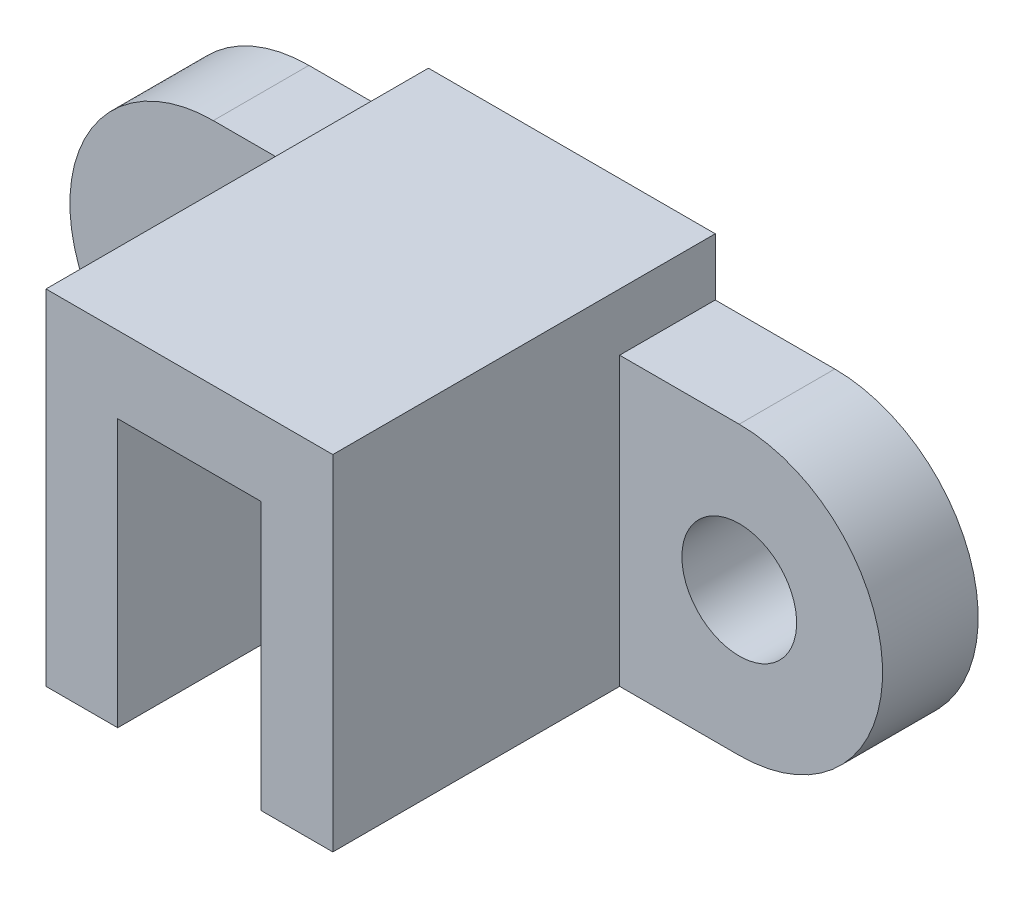
ISO-10303-21;
HEADER;
FILE_DESCRIPTION(('STEP AP214'),'2;1');
FILE_NAME('part.step','',(''),(''),'','','');
FILE_SCHEMA(('AUTOMOTIVE_DESIGN { 1 0 10303 214 1 1 1 1 }'));
ENDSEC;
DATA;
#1=APPLICATION_CONTEXT('core data for automotive mechanical design processes');
#2=APPLICATION_PROTOCOL_DEFINITION('international standard','automotive_design',2000,#1);
#3=PRODUCT_CONTEXT('',#1,'mechanical');
#4=PRODUCT('Part','Part','',(#3));
#5=PRODUCT_RELATED_PRODUCT_CATEGORY('part','',(#4));
#6=PRODUCT_DEFINITION_FORMATION('','',#4);
#7=PRODUCT_DEFINITION_CONTEXT('part definition',#1,'design');
#8=PRODUCT_DEFINITION('design','',#6,#7);
#9=PRODUCT_DEFINITION_SHAPE('','',#8);
#10=(LENGTH_UNIT() NAMED_UNIT(*) SI_UNIT(.MILLI.,.METRE.));
#11=(NAMED_UNIT(*) PLANE_ANGLE_UNIT() SI_UNIT($,.RADIAN.));
#12=(NAMED_UNIT(*) SI_UNIT($,.STERADIAN.) SOLID_ANGLE_UNIT());
#13=UNCERTAINTY_MEASURE_WITH_UNIT(LENGTH_MEASURE(1.E-05),#10,'distance_accuracy_value','');
#14=(GEOMETRIC_REPRESENTATION_CONTEXT(3) GLOBAL_UNCERTAINTY_ASSIGNED_CONTEXT((#13)) GLOBAL_UNIT_ASSIGNED_CONTEXT((#10,
#11,#12)) REPRESENTATION_CONTEXT('',''));
#15=CARTESIAN_POINT('',(0.,0.,0.));
#16=DIRECTION('',(0.,0.,1.));
#17=DIRECTION('',(1.,0.,0.));
#18=AXIS2_PLACEMENT_3D('',#15,#16,#17);
#19=CARTESIAN_POINT('',(-27.4999999999999,-18.,10.));
#20=DIRECTION('',(0.,1.,0.));
#21=DIRECTION('',(-1.,0.,0.));
#22=AXIS2_PLACEMENT_3D('',#19,#20,#21);
#23=PLANE('',#22);
#24=DIRECTION('',(0.,0.,1.));
#25=VECTOR('',#24,1.);
#26=CARTESIAN_POINT('',(-7.49999999999999,-18.,0.));
#27=LINE('',#26,#25);
#28=CARTESIAN_POINT('',(-7.49999999999999,-18.,0.));
#29=VERTEX_POINT('',#28);
#30=CARTESIAN_POINT('',(-7.49999999999999,-18.,40.));
#31=VERTEX_POINT('',#30);
#32=EDGE_CURVE('E161',#29,#31,#27,.T.);
#33=ORIENTED_EDGE('',*,*,#32,.T.);
#34=DIRECTION('',(1.,0.,0.));
#35=VECTOR('',#34,1.);
#36=CARTESIAN_POINT('',(15.,-18.,40.));
#37=LINE('',#36,#35);
#38=CARTESIAN_POINT('',(-15.,-18.,40.));
#39=VERTEX_POINT('',#38);
#40=EDGE_CURVE('E188',#39,#31,#37,.T.);
#41=ORIENTED_EDGE('',*,*,#40,.F.);
#42=DIRECTION('',(0.,0.,-1.));
#43=VECTOR('',#42,1.);
#44=CARTESIAN_POINT('',(-15.,-18.,40.));
#45=LINE('',#44,#43);
#46=CARTESIAN_POINT('',(-15.,-18.,10.));
#47=VERTEX_POINT('',#46);
#48=EDGE_CURVE('E201',#39,#47,#45,.T.);
#49=ORIENTED_EDGE('',*,*,#48,.T.);
#50=DIRECTION('',(-1.,0.,0.));
#51=VECTOR('',#50,1.);
#52=CARTESIAN_POINT('',(27.4999999999999,-18.,10.));
#53=LINE('',#52,#51);
#54=CARTESIAN_POINT('',(-27.4999999999999,-18.,10.));
#55=VERTEX_POINT('',#54);
#56=EDGE_CURVE('E66',#47,#55,#53,.T.);
#57=ORIENTED_EDGE('',*,*,#56,.T.);
#58=DIRECTION('',(0.,0.,-1.));
#59=VECTOR('',#58,1.);
#60=CARTESIAN_POINT('',(-27.4999999999999,-18.,10.));
#61=LINE('',#60,#59);
#62=CARTESIAN_POINT('',(-27.4999999999999,-18.,0.));
#63=VERTEX_POINT('',#62);
#64=EDGE_CURVE('E243',#55,#63,#61,.T.);
#65=ORIENTED_EDGE('',*,*,#64,.T.);
#66=DIRECTION('',(1.,0.,0.));
#67=VECTOR('',#66,1.);
#68=CARTESIAN_POINT('',(-27.4999999999999,-18.,0.));
#69=LINE('',#68,#67);
#70=EDGE_CURVE('E233',#63,#29,#69,.T.);
#71=ORIENTED_EDGE('',*,*,#70,.T.);
#72=EDGE_LOOP('',(#33,#41,#49,#57,#65,#71));
#73=FACE_BOUND('',#72,.T.);
#74=ADVANCED_FACE('F41',(#73),#23,.F.);
#75=CARTESIAN_POINT('',(27.5,-3.,10.));
#76=DIRECTION('',(0.,0.,-1.));
#77=DIRECTION('',(-1.,0.,0.));
#78=AXIS2_PLACEMENT_3D('',#75,#76,#77);
#79=PLANE('',#78);
#80=CARTESIAN_POINT('',(-27.5,-3.,10.));
#81=DIRECTION('',(0.,0.,-1.));
#82=DIRECTION('',(-1.,0.,0.));
#83=AXIS2_PLACEMENT_3D('',#80,#81,#82);
#84=CIRCLE('',#83,6.);
#85=CARTESIAN_POINT('',(-33.5,-3.,10.));
#86=VERTEX_POINT('',#85);
#87=EDGE_CURVE('E180',#86,#86,#84,.F.);
#88=ORIENTED_EDGE('',*,*,#87,.F.);
#89=EDGE_LOOP('',(#88));
#90=FACE_BOUND('',#89,.T.);
#91=DIRECTION('',(0.,-1.,0.));
#92=VECTOR('',#91,1.);
#93=CARTESIAN_POINT('',(-15.,-18.,10.));
#94=LINE('',#93,#92);
#95=CARTESIAN_POINT('',(-15.,12.,10.));
#96=VERTEX_POINT('',#95);
#97=EDGE_CURVE('E11',#96,#47,#94,.T.);
#98=ORIENTED_EDGE('',*,*,#97,.F.);
#99=DIRECTION('',(-1.,0.,0.));
#100=VECTOR('',#99,1.);
#101=CARTESIAN_POINT('',(-15.,12.,10.));
#102=LINE('',#101,#100);
#103=CARTESIAN_POINT('',(-27.4999999999999,12.,10.));
#104=VERTEX_POINT('',#103);
#105=EDGE_CURVE('E216',#96,#104,#102,.T.);
#106=ORIENTED_EDGE('',*,*,#105,.T.);
#107=CARTESIAN_POINT('',(-27.5,-3.,10.));
#108=DIRECTION('',(0.,0.,1.));
#109=DIRECTION('',(1.,0.,0.));
#110=AXIS2_PLACEMENT_3D('',#107,#108,#109);
#111=CIRCLE('',#110,15.);
#112=EDGE_CURVE('E214',#104,#55,#111,.T.);
#113=ORIENTED_EDGE('',*,*,#112,.T.);
#114=ORIENTED_EDGE('',*,*,#56,.F.);
#115=EDGE_LOOP('',(#98,#106,#113,#114));
#116=FACE_BOUND('',#115,.T.);
#117=ADVANCED_FACE('F278',(#90,#116),#79,.F.);
#118=CARTESIAN_POINT('',(27.511001477956,-3.,10.));
#119=DIRECTION('',(0.,0.,-1.));
#120=DIRECTION('',(-1.,0.,0.));
#121=AXIS2_PLACEMENT_3D('',#118,#119,#120);
#122=CIRCLE('',#121,6.);
#123=CARTESIAN_POINT('',(21.511001477956,-3.,10.));
#124=VERTEX_POINT('',#123);
#125=EDGE_CURVE('E175',#124,#124,#122,.F.);
#126=ORIENTED_EDGE('',*,*,#125,.F.);
#127=EDGE_LOOP('',(#126));
#128=FACE_BOUND('',#127,.T.);
#129=DIRECTION('',(0.,1.,0.));
#130=VECTOR('',#129,1.);
#131=CARTESIAN_POINT('',(15.,18.,10.));
#132=LINE('',#131,#130);
#133=CARTESIAN_POINT('',(15.,-18.,10.));
#134=VERTEX_POINT('',#133);
#135=CARTESIAN_POINT('',(15.,12.,10.));
#136=VERTEX_POINT('',#135);
#137=EDGE_CURVE('E183',#134,#136,#132,.T.);
#138=ORIENTED_EDGE('',*,*,#137,.F.);
#139=CARTESIAN_POINT('',(27.4999999999999,-18.,10.));
#140=VERTEX_POINT('',#139);
#141=EDGE_CURVE('E211',#140,#134,#53,.T.);
#142=ORIENTED_EDGE('',*,*,#141,.F.);
#143=CARTESIAN_POINT('',(27.5,-3.,10.));
#144=DIRECTION('',(0.,0.,-1.));
#145=DIRECTION('',(-1.,0.,0.));
#146=AXIS2_PLACEMENT_3D('',#143,#144,#145);
#147=CIRCLE('',#146,15.);
#148=CARTESIAN_POINT('',(27.4999999999999,12.,10.));
#149=VERTEX_POINT('',#148);
#150=EDGE_CURVE('E208',#149,#140,#147,.T.);
#151=ORIENTED_EDGE('',*,*,#150,.F.);
#152=DIRECTION('',(1.,0.,0.));
#153=VECTOR('',#152,1.);
#154=CARTESIAN_POINT('',(15.,12.,10.));
#155=LINE('',#154,#153);
#156=EDGE_CURVE('E205',#136,#149,#155,.T.);
#157=ORIENTED_EDGE('',*,*,#156,.F.);
#158=EDGE_LOOP('',(#138,#142,#151,#157));
#159=FACE_BOUND('',#158,.T.);
#160=ADVANCED_FACE('F295',(#128,#159),#79,.F.);
#161=CARTESIAN_POINT('',(-15.,12.,10.));
#162=DIRECTION('',(-1.,0.,0.));
#163=DIRECTION('',(0.,-1.,0.));
#164=AXIS2_PLACEMENT_3D('',#161,#162,#163);
#165=PLANE('',#164);
#166=DIRECTION('',(0.,1.,0.));
#167=VECTOR('',#166,1.);
#168=CARTESIAN_POINT('',(-15.,12.,0.));
#169=LINE('',#168,#167);
#170=CARTESIAN_POINT('',(-15.,12.,0.));
#171=VERTEX_POINT('',#170);
#172=CARTESIAN_POINT('',(-15.,18.,0.));
#173=VERTEX_POINT('',#172);
#174=EDGE_CURVE('E204',#171,#173,#169,.T.);
#175=ORIENTED_EDGE('',*,*,#174,.F.);
#176=DIRECTION('',(0.,0.,-1.));
#177=VECTOR('',#176,1.);
#178=CARTESIAN_POINT('',(-15.,12.,10.));
#179=LINE('',#178,#177);
#180=EDGE_CURVE('E50',#96,#171,#179,.T.);
#181=ORIENTED_EDGE('',*,*,#180,.F.);
#182=ORIENTED_EDGE('',*,*,#97,.T.);
#183=ORIENTED_EDGE('',*,*,#48,.F.);
#184=DIRECTION('',(0.,-1.,0.));
#185=VECTOR('',#184,1.);
#186=CARTESIAN_POINT('',(-15.,-18.,40.));
#187=LINE('',#186,#185);
#188=CARTESIAN_POINT('',(-15.,18.,40.));
#189=VERTEX_POINT('',#188);
#190=EDGE_CURVE('E184',#189,#39,#187,.T.);
#191=ORIENTED_EDGE('',*,*,#190,.F.);
#192=DIRECTION('',(0.,0.,-1.));
#193=VECTOR('',#192,1.);
#194=CARTESIAN_POINT('',(-15.,18.,10.));
#195=LINE('',#194,#193);
#196=EDGE_CURVE('E45',#189,#173,#195,.T.);
#197=ORIENTED_EDGE('',*,*,#196,.T.);
#198=EDGE_LOOP('',(#175,#181,#182,#183,#191,#197));
#199=FACE_BOUND('',#198,.T.);
#200=ADVANCED_FACE('F43',(#199),#165,.T.);
#201=CARTESIAN_POINT('',(-15.,12.,10.));
#202=DIRECTION('',(0.,-1.,0.));
#203=DIRECTION('',(0.,0.,-1.));
#204=AXIS2_PLACEMENT_3D('',#201,#202,#203);
#205=PLANE('',#204);
#206=DIRECTION('',(-1.,0.,0.));
#207=VECTOR('',#206,1.);
#208=CARTESIAN_POINT('',(-15.,12.,0.));
#209=LINE('',#208,#207);
#210=CARTESIAN_POINT('',(-27.4999999999999,12.,0.));
#211=VERTEX_POINT('',#210);
#212=EDGE_CURVE('E209',#171,#211,#209,.T.);
#213=ORIENTED_EDGE('',*,*,#212,.T.);
#214=DIRECTION('',(0.,0.,-1.));
#215=VECTOR('',#214,1.);
#216=CARTESIAN_POINT('',(-27.4999999999999,12.,10.));
#217=LINE('',#216,#215);
#218=EDGE_CURVE('E240',#104,#211,#217,.T.);
#219=ORIENTED_EDGE('',*,*,#218,.F.);
#220=ORIENTED_EDGE('',*,*,#105,.F.);
#221=ORIENTED_EDGE('',*,*,#180,.T.);
#222=EDGE_LOOP('',(#213,#219,#220,#221));
#223=FACE_BOUND('',#222,.T.);
#224=ADVANCED_FACE('F273',(#223),#205,.F.);
#225=CARTESIAN_POINT('',(-27.5,-3.,10.));
#226=DIRECTION('',(0.,0.,-1.));
#227=DIRECTION('',(-1.,0.,0.));
#228=AXIS2_PLACEMENT_3D('',#225,#226,#227);
#229=CYLINDRICAL_SURFACE('',#228,15.);
#230=CARTESIAN_POINT('',(-27.5,-3.,0.));
#231=DIRECTION('',(0.,0.,1.));
#232=DIRECTION('',(1.,0.,0.));
#233=AXIS2_PLACEMENT_3D('',#230,#231,#232);
#234=CIRCLE('',#233,15.);
#235=EDGE_CURVE('E236',#211,#63,#234,.T.);
#236=ORIENTED_EDGE('',*,*,#235,.T.);
#237=ORIENTED_EDGE('',*,*,#64,.F.);
#238=ORIENTED_EDGE('',*,*,#112,.F.);
#239=ORIENTED_EDGE('',*,*,#218,.T.);
#240=EDGE_LOOP('',(#236,#237,#238,#239));
#241=FACE_BOUND('',#240,.T.);
#242=ADVANCED_FACE('F276',(#241),#229,.T.);
#243=CARTESIAN_POINT('',(7.50000000000001,-18.,40.));
#244=VERTEX_POINT('',#243);
#245=CARTESIAN_POINT('',(15.,-18.,40.));
#246=VERTEX_POINT('',#245);
#247=EDGE_CURVE('E187',#244,#246,#37,.T.);
#248=ORIENTED_EDGE('',*,*,#247,.F.);
#249=DIRECTION('',(0.,0.,1.));
#250=VECTOR('',#249,1.);
#251=CARTESIAN_POINT('',(7.50000000000001,-18.,0.));
#252=LINE('',#251,#250);
#253=CARTESIAN_POINT('',(7.50000000000001,-18.,0.));
#254=VERTEX_POINT('',#253);
#255=EDGE_CURVE('E158',#254,#244,#252,.T.);
#256=ORIENTED_EDGE('',*,*,#255,.F.);
#257=CARTESIAN_POINT('',(27.4999999999999,-18.,0.));
#258=VERTEX_POINT('',#257);
#259=EDGE_CURVE('E232',#254,#258,#69,.T.);
#260=ORIENTED_EDGE('',*,*,#259,.T.);
#261=DIRECTION('',(0.,0.,-1.));
#262=VECTOR('',#261,1.);
#263=CARTESIAN_POINT('',(27.4999999999999,-18.,10.));
#264=LINE('',#263,#262);
#265=EDGE_CURVE('E246',#140,#258,#264,.T.);
#266=ORIENTED_EDGE('',*,*,#265,.F.);
#267=ORIENTED_EDGE('',*,*,#141,.T.);
#268=DIRECTION('',(0.,0.,-1.));
#269=VECTOR('',#268,1.);
#270=CARTESIAN_POINT('',(15.,-18.,40.));
#271=LINE('',#270,#269);
#272=EDGE_CURVE('E195',#246,#134,#271,.T.);
#273=ORIENTED_EDGE('',*,*,#272,.F.);
#274=EDGE_LOOP('',(#248,#256,#260,#266,#267,#273));
#275=FACE_BOUND('',#274,.T.);
#276=ADVANCED_FACE('F297',(#275),#23,.F.);
#277=CARTESIAN_POINT('',(27.5,-3.,10.));
#278=DIRECTION('',(0.,0.,-1.));
#279=DIRECTION('',(-1.,0.,0.));
#280=AXIS2_PLACEMENT_3D('',#277,#278,#279);
#281=CYLINDRICAL_SURFACE('',#280,15.);
#282=CARTESIAN_POINT('',(27.5,-3.,0.));
#283=DIRECTION('',(0.,0.,-1.));
#284=DIRECTION('',(-1.,0.,0.));
#285=AXIS2_PLACEMENT_3D('',#282,#283,#284);
#286=CIRCLE('',#285,15.);
#287=CARTESIAN_POINT('',(27.4999999999999,12.,0.));
#288=VERTEX_POINT('',#287);
#289=EDGE_CURVE('E229',#288,#258,#286,.T.);
#290=ORIENTED_EDGE('',*,*,#289,.F.);
#291=DIRECTION('',(0.,0.,-1.));
#292=VECTOR('',#291,1.);
#293=CARTESIAN_POINT('',(27.4999999999999,12.,10.));
#294=LINE('',#293,#292);
#295=EDGE_CURVE('E249',#149,#288,#294,.T.);
#296=ORIENTED_EDGE('',*,*,#295,.F.);
#297=ORIENTED_EDGE('',*,*,#150,.T.);
#298=ORIENTED_EDGE('',*,*,#265,.T.);
#299=EDGE_LOOP('',(#290,#296,#297,#298));
#300=FACE_BOUND('',#299,.T.);
#301=ADVANCED_FACE('F291',(#300),#281,.T.);
#302=CARTESIAN_POINT('',(15.,12.,10.));
#303=DIRECTION('',(0.,1.,0.));
#304=DIRECTION('',(0.,0.,1.));
#305=AXIS2_PLACEMENT_3D('',#302,#303,#304);
#306=PLANE('',#305);
#307=DIRECTION('',(1.,0.,0.));
#308=VECTOR('',#307,1.);
#309=CARTESIAN_POINT('',(15.,12.,0.));
#310=LINE('',#309,#308);
#311=CARTESIAN_POINT('',(15.,12.,0.));
#312=VERTEX_POINT('',#311);
#313=EDGE_CURVE('E226',#312,#288,#310,.T.);
#314=ORIENTED_EDGE('',*,*,#313,.F.);
#315=DIRECTION('',(0.,0.,-1.));
#316=VECTOR('',#315,1.);
#317=CARTESIAN_POINT('',(15.,12.,10.));
#318=LINE('',#317,#316);
#319=EDGE_CURVE('E252',#136,#312,#318,.T.);
#320=ORIENTED_EDGE('',*,*,#319,.F.);
#321=ORIENTED_EDGE('',*,*,#156,.T.);
#322=ORIENTED_EDGE('',*,*,#295,.T.);
#323=EDGE_LOOP('',(#314,#320,#321,#322));
#324=FACE_BOUND('',#323,.T.);
#325=ADVANCED_FACE('F287',(#324),#306,.T.);
#326=CARTESIAN_POINT('',(15.,12.,10.));
#327=DIRECTION('',(-1.,0.,0.));
#328=DIRECTION('',(0.,-1.,0.));
#329=AXIS2_PLACEMENT_3D('',#326,#327,#328);
#330=PLANE('',#329);
#331=DIRECTION('',(0.,1.,0.));
#332=VECTOR('',#331,1.);
#333=CARTESIAN_POINT('',(15.,12.,0.));
#334=LINE('',#333,#332);
#335=CARTESIAN_POINT('',(15.,18.,0.));
#336=VERTEX_POINT('',#335);
#337=EDGE_CURVE('E224',#312,#336,#334,.T.);
#338=ORIENTED_EDGE('',*,*,#337,.T.);
#339=DIRECTION('',(0.,0.,-1.));
#340=VECTOR('',#339,1.);
#341=CARTESIAN_POINT('',(15.,18.,10.));
#342=LINE('',#341,#340);
#343=CARTESIAN_POINT('',(15.,18.,40.));
#344=VERTEX_POINT('',#343);
#345=EDGE_CURVE('E253',#344,#336,#342,.T.);
#346=ORIENTED_EDGE('',*,*,#345,.F.);
#347=DIRECTION('',(0.,1.,0.));
#348=VECTOR('',#347,1.);
#349=CARTESIAN_POINT('',(15.,18.,40.));
#350=LINE('',#349,#348);
#351=EDGE_CURVE('E190',#246,#344,#350,.T.);
#352=ORIENTED_EDGE('',*,*,#351,.F.);
#353=ORIENTED_EDGE('',*,*,#272,.T.);
#354=ORIENTED_EDGE('',*,*,#137,.T.);
#355=ORIENTED_EDGE('',*,*,#319,.T.);
#356=EDGE_LOOP('',(#338,#346,#352,#353,#354,#355));
#357=FACE_BOUND('',#356,.T.);
#358=ADVANCED_FACE('F284',(#357),#330,.F.);
#359=CARTESIAN_POINT('',(15.,18.,10.));
#360=DIRECTION('',(0.,-1.,0.));
#361=DIRECTION('',(1.,0.,0.));
#362=AXIS2_PLACEMENT_3D('',#359,#360,#361);
#363=PLANE('',#362);
#364=DIRECTION('',(-1.,0.,0.));
#365=VECTOR('',#364,1.);
#366=CARTESIAN_POINT('',(15.,18.,0.));
#367=LINE('',#366,#365);
#368=EDGE_CURVE('E221',#336,#173,#367,.T.);
#369=ORIENTED_EDGE('',*,*,#368,.T.);
#370=ORIENTED_EDGE('',*,*,#196,.F.);
#371=DIRECTION('',(-1.,0.,0.));
#372=VECTOR('',#371,1.);
#373=CARTESIAN_POINT('',(-15.,18.,40.));
#374=LINE('',#373,#372);
#375=EDGE_CURVE('E193',#344,#189,#374,.T.);
#376=ORIENTED_EDGE('',*,*,#375,.F.);
#377=ORIENTED_EDGE('',*,*,#345,.T.);
#378=EDGE_LOOP('',(#369,#370,#376,#377));
#379=FACE_BOUND('',#378,.T.);
#380=ADVANCED_FACE('F263',(#379),#363,.F.);
#381=CARTESIAN_POINT('',(27.5,-3.,0.));
#382=DIRECTION('',(0.,0.,-1.));
#383=DIRECTION('',(-1.,0.,0.));
#384=AXIS2_PLACEMENT_3D('',#381,#382,#383);
#385=PLANE('',#384);
#386=DIRECTION('',(0.,-1.,0.));
#387=VECTOR('',#386,1.);
#388=CARTESIAN_POINT('',(7.50000000000001,-12.,0.));
#389=LINE('',#388,#387);
#390=CARTESIAN_POINT('',(7.50000000000001,-12.,0.));
#391=VERTEX_POINT('',#390);
#392=EDGE_CURVE('E152',#391,#254,#389,.T.);
#393=ORIENTED_EDGE('',*,*,#392,.F.);
#394=DIRECTION('',(-1.,0.,0.));
#395=VECTOR('',#394,1.);
#396=CARTESIAN_POINT('',(7.50000000000001,-12.,0.));
#397=LINE('',#396,#395);
#398=CARTESIAN_POINT('',(-7.49999999999999,-12.,0.));
#399=VERTEX_POINT('',#398);
#400=EDGE_CURVE('E149',#391,#399,#397,.T.);
#401=ORIENTED_EDGE('',*,*,#400,.T.);
#402=DIRECTION('',(0.,-1.,0.));
#403=VECTOR('',#402,1.);
#404=CARTESIAN_POINT('',(-7.49999999999999,-12.,0.));
#405=LINE('',#404,#403);
#406=EDGE_CURVE('E304',#399,#29,#405,.T.);
#407=ORIENTED_EDGE('',*,*,#406,.T.);
#408=ORIENTED_EDGE('',*,*,#70,.F.);
#409=ORIENTED_EDGE('',*,*,#235,.F.);
#410=ORIENTED_EDGE('',*,*,#212,.F.);
#411=ORIENTED_EDGE('',*,*,#174,.T.);
#412=ORIENTED_EDGE('',*,*,#368,.F.);
#413=ORIENTED_EDGE('',*,*,#337,.F.);
#414=ORIENTED_EDGE('',*,*,#313,.T.);
#415=ORIENTED_EDGE('',*,*,#289,.T.);
#416=ORIENTED_EDGE('',*,*,#259,.F.);
#417=EDGE_LOOP('',(#393,#401,#407,#408,#409,#410,#411,#412,#413,#414,#415,#416));
#418=FACE_BOUND('',#417,.T.);
#419=CARTESIAN_POINT('',(-27.5,-3.,0.));
#420=DIRECTION('',(0.,0.,1.));
#421=DIRECTION('',(1.,0.,0.));
#422=AXIS2_PLACEMENT_3D('',#419,#420,#421);
#423=CIRCLE('',#422,6.);
#424=CARTESIAN_POINT('',(-21.5,-3.,0.));
#425=VERTEX_POINT('',#424);
#426=EDGE_CURVE('E172',#425,#425,#423,.T.);
#427=ORIENTED_EDGE('',*,*,#426,.T.);
#428=EDGE_LOOP('',(#427));
#429=FACE_BOUND('',#428,.T.);
#430=CARTESIAN_POINT('',(27.511001477956,-3.,0.));
#431=DIRECTION('',(0.,0.,1.));
#432=DIRECTION('',(1.,0.,0.));
#433=AXIS2_PLACEMENT_3D('',#430,#431,#432);
#434=CIRCLE('',#433,6.);
#435=CARTESIAN_POINT('',(33.5110014779561,-3.,0.));
#436=VERTEX_POINT('',#435);
#437=EDGE_CURVE('E167',#436,#436,#434,.T.);
#438=ORIENTED_EDGE('',*,*,#437,.T.);
#439=EDGE_LOOP('',(#438));
#440=FACE_BOUND('',#439,.T.);
#441=ADVANCED_FACE('F267',(#418,#429,#440),#385,.T.);
#442=CARTESIAN_POINT('',(0.,0.,40.));
#443=DIRECTION('',(0.,0.,-1.));
#444=DIRECTION('',(-1.,0.,0.));
#445=AXIS2_PLACEMENT_3D('',#442,#443,#444);
#446=PLANE('',#445);
#447=DIRECTION('',(-1.,0.,0.));
#448=VECTOR('',#447,1.);
#449=CARTESIAN_POINT('',(7.5,10.,40.));
#450=LINE('',#449,#448);
#451=CARTESIAN_POINT('',(7.5,10.,40.));
#452=VERTEX_POINT('',#451);
#453=CARTESIAN_POINT('',(-7.5,9.99999999999999,40.));
#454=VERTEX_POINT('',#453);
#455=EDGE_CURVE('E146',#452,#454,#450,.T.);
#456=ORIENTED_EDGE('',*,*,#455,.F.);
#457=DIRECTION('',(0.,1.,0.));
#458=VECTOR('',#457,1.);
#459=CARTESIAN_POINT('',(7.50000000000001,-18.,40.));
#460=LINE('',#459,#458);
#461=EDGE_CURVE('E153',#244,#452,#460,.T.);
#462=ORIENTED_EDGE('',*,*,#461,.F.);
#463=ORIENTED_EDGE('',*,*,#247,.T.);
#464=ORIENTED_EDGE('',*,*,#351,.T.);
#465=ORIENTED_EDGE('',*,*,#375,.T.);
#466=ORIENTED_EDGE('',*,*,#190,.T.);
#467=ORIENTED_EDGE('',*,*,#40,.T.);
#468=DIRECTION('',(0.,1.,0.));
#469=VECTOR('',#468,1.);
#470=CARTESIAN_POINT('',(-7.49999999999999,-18.,40.));
#471=LINE('',#470,#469);
#472=EDGE_CURVE('E165',#31,#454,#471,.T.);
#473=ORIENTED_EDGE('',*,*,#472,.T.);
#474=EDGE_LOOP('',(#456,#462,#463,#464,#465,#466,#467,#473));
#475=FACE_BOUND('',#474,.T.);
#476=ADVANCED_FACE('F163',(#475),#446,.F.);
#477=CARTESIAN_POINT('',(27.511001477956,-3.,52.));
#478=DIRECTION('',(0.,0.,-1.));
#479=DIRECTION('',(-1.,0.,0.));
#480=AXIS2_PLACEMENT_3D('',#477,#478,#479);
#481=CYLINDRICAL_SURFACE('',#480,6.);
#482=ORIENTED_EDGE('',*,*,#437,.F.);
#483=EDGE_LOOP('',(#482));
#484=FACE_BOUND('',#483,.T.);
#485=ORIENTED_EDGE('',*,*,#125,.T.);
#486=EDGE_LOOP('',(#485));
#487=FACE_BOUND('',#486,.T.);
#488=ADVANCED_FACE('F337',(#484,#487),#481,.F.);
#489=CARTESIAN_POINT('',(-27.5,-3.,52.));
#490=DIRECTION('',(0.,0.,-1.));
#491=DIRECTION('',(-1.,0.,0.));
#492=AXIS2_PLACEMENT_3D('',#489,#490,#491);
#493=CYLINDRICAL_SURFACE('',#492,6.);
#494=ORIENTED_EDGE('',*,*,#426,.F.);
#495=EDGE_LOOP('',(#494));
#496=FACE_BOUND('',#495,.T.);
#497=ORIENTED_EDGE('',*,*,#87,.T.);
#498=EDGE_LOOP('',(#497));
#499=FACE_BOUND('',#498,.T.);
#500=ADVANCED_FACE('F340',(#496,#499),#493,.F.);
#501=CARTESIAN_POINT('',(7.5,10.,40.));
#502=DIRECTION('',(0.,0.876215908676647,-0.481918749772156));
#503=DIRECTION('',(0.,0.481918749772156,0.876215908676647));
#504=AXIS2_PLACEMENT_3D('',#501,#502,#503);
#505=PLANE('',#504);
#506=DIRECTION('',(0.,-0.481918749772156,-0.876215908676647));
#507=VECTOR('',#506,1.);
#508=CARTESIAN_POINT('',(-7.5,9.99999999999999,40.));
#509=LINE('',#508,#507);
#510=EDGE_CURVE('E58',#454,#399,#509,.T.);
#511=ORIENTED_EDGE('',*,*,#510,.T.);
#512=ORIENTED_EDGE('',*,*,#400,.F.);
#513=DIRECTION('',(0.,-0.481918749772156,-0.876215908676647));
#514=VECTOR('',#513,1.);
#515=CARTESIAN_POINT('',(7.5,10.,40.));
#516=LINE('',#515,#514);
#517=EDGE_CURVE('E142',#452,#391,#516,.T.);
#518=ORIENTED_EDGE('',*,*,#517,.F.);
#519=ORIENTED_EDGE('',*,*,#455,.T.);
#520=EDGE_LOOP('',(#511,#512,#518,#519));
#521=FACE_BOUND('',#520,.T.);
#522=ADVANCED_FACE('F144',(#521),#505,.F.);
#523=CARTESIAN_POINT('',(7.50000000000001,0.,0.));
#524=DIRECTION('',(1.,0.,0.));
#525=DIRECTION('',(0.,1.,0.));
#526=AXIS2_PLACEMENT_3D('',#523,#524,#525);
#527=PLANE('',#526);
#528=ORIENTED_EDGE('',*,*,#461,.T.);
#529=ORIENTED_EDGE('',*,*,#517,.T.);
#530=ORIENTED_EDGE('',*,*,#392,.T.);
#531=ORIENTED_EDGE('',*,*,#255,.T.);
#532=EDGE_LOOP('',(#528,#529,#530,#531));
#533=FACE_BOUND('',#532,.T.);
#534=ADVANCED_FACE('F156',(#533),#527,.F.);
#535=CARTESIAN_POINT('',(-7.49999999999999,0.,0.));
#536=DIRECTION('',(1.,0.,0.));
#537=DIRECTION('',(0.,1.,0.));
#538=AXIS2_PLACEMENT_3D('',#535,#536,#537);
#539=PLANE('',#538);
#540=ORIENTED_EDGE('',*,*,#472,.F.);
#541=ORIENTED_EDGE('',*,*,#32,.F.);
#542=ORIENTED_EDGE('',*,*,#406,.F.);
#543=ORIENTED_EDGE('',*,*,#510,.F.);
#544=EDGE_LOOP('',(#540,#541,#542,#543));
#545=FACE_BOUND('',#544,.T.);
#546=ADVANCED_FACE('F305',(#545),#539,.T.);
#547=CLOSED_SHELL('',(#74,#117,#160,#200,#224,#242,#276,#301,#325,#358,#380,#441,#476,#488,#500,
#522,#534,#546));
#548=MANIFOLD_SOLID_BREP('B2',#547);
#549=ADVANCED_BREP_SHAPE_REPRESENTATION('',(#18,#548),#14);
#550=SHAPE_DEFINITION_REPRESENTATION(#9,#549);
ENDSEC;
END-ISO-10303-21;
